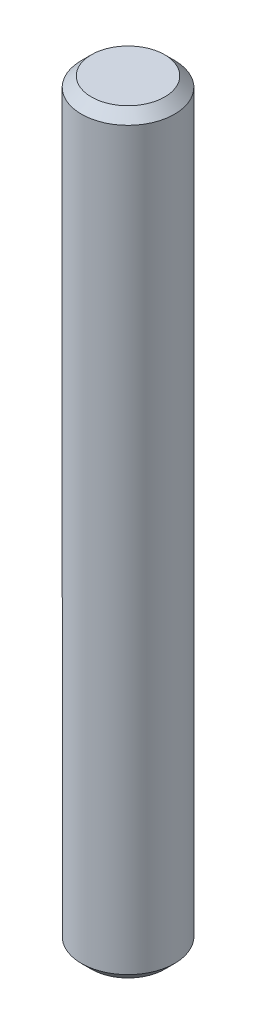
ISO-10303-21;
HEADER;
FILE_DESCRIPTION(('STEP AP214'),'2;1');
FILE_NAME('part.step','',(''),(''),'','','');
FILE_SCHEMA(('AUTOMOTIVE_DESIGN { 1 0 10303 214 1 1 1 1 }'));
ENDSEC;
DATA;
#1=APPLICATION_CONTEXT('core data for automotive mechanical design processes');
#2=APPLICATION_PROTOCOL_DEFINITION('international standard','automotive_design',2000,#1);
#3=PRODUCT_CONTEXT('',#1,'mechanical');
#4=PRODUCT('Part','Part','',(#3));
#5=PRODUCT_RELATED_PRODUCT_CATEGORY('part','',(#4));
#6=PRODUCT_DEFINITION_FORMATION('','',#4);
#7=PRODUCT_DEFINITION_CONTEXT('part definition',#1,'design');
#8=PRODUCT_DEFINITION('design','',#6,#7);
#9=PRODUCT_DEFINITION_SHAPE('','',#8);
#10=(LENGTH_UNIT() NAMED_UNIT(*) SI_UNIT(.MILLI.,.METRE.));
#11=(NAMED_UNIT(*) PLANE_ANGLE_UNIT() SI_UNIT($,.RADIAN.));
#12=(NAMED_UNIT(*) SI_UNIT($,.STERADIAN.) SOLID_ANGLE_UNIT());
#13=UNCERTAINTY_MEASURE_WITH_UNIT(LENGTH_MEASURE(1.E-05),#10,'distance_accuracy_value','');
#14=(GEOMETRIC_REPRESENTATION_CONTEXT(3) GLOBAL_UNCERTAINTY_ASSIGNED_CONTEXT((#13)) GLOBAL_UNIT_ASSIGNED_CONTEXT((#10,
#11,#12)) REPRESENTATION_CONTEXT('',''));
#15=CARTESIAN_POINT('',(0.,0.,0.));
#16=DIRECTION('',(0.,0.,1.));
#17=DIRECTION('',(1.,0.,0.));
#18=AXIS2_PLACEMENT_3D('',#15,#16,#17);
#19=CARTESIAN_POINT('',(0.,48.26,0.));
#20=DIRECTION('',(0.,-1.,0.));
#21=DIRECTION('',(0.,0.,-1.));
#22=AXIS2_PLACEMENT_3D('',#19,#20,#21);
#23=CYLINDRICAL_SURFACE('',#22,2.97500000000001);
#24=CARTESIAN_POINT('',(0.,0.635000000000018,0.));
#25=DIRECTION('',(0.,1.,0.));
#26=DIRECTION('',(0.,0.,1.));
#27=AXIS2_PLACEMENT_3D('',#24,#25,#26);
#28=CIRCLE('',#27,2.97500000000001);
#29=CARTESIAN_POINT('',(0.,0.635000000000018,-2.97500000000001));
#30=VERTEX_POINT('',#29);
#31=EDGE_CURVE('E59',#30,#30,#28,.T.);
#32=CARTESIAN_POINT('',(0.,47.625,0.));
#33=DIRECTION('',(0.,1.,0.));
#34=DIRECTION('',(0.,0.,1.));
#35=AXIS2_PLACEMENT_3D('',#32,#33,#34);
#36=CIRCLE('',#35,2.97500000000001);
#37=CARTESIAN_POINT('',(0.,47.625,-2.97500000000001));
#38=VERTEX_POINT('',#37);
#39=EDGE_CURVE('E64',#38,#38,#36,.F.);
#40=CARTESIAN_POINT('',(0.,0.635000000000018,-2.97500000000001));
#41=CARTESIAN_POINT('',(0.,1.12447916666668,-2.97500000000001));
#42=CARTESIAN_POINT('',(0.,1.61395833333335,-2.97500000000001));
#43=CARTESIAN_POINT('',(0.,2.59291666666669,-2.97500000000001));
#44=CARTESIAN_POINT('',(0.,3.08239583333335,-2.97500000000001));
#45=CARTESIAN_POINT('',(0.,4.06135416666668,-2.97500000000001));
#46=CARTESIAN_POINT('',(0.,4.55083333333335,-2.97500000000001));
#47=CARTESIAN_POINT('',(0.,5.52979166666668,-2.97500000000001));
#48=CARTESIAN_POINT('',(0.,6.01927083333335,-2.97500000000001));
#49=CARTESIAN_POINT('',(0.,6.99822916666668,-2.97500000000001));
#50=CARTESIAN_POINT('',(0.,7.48770833333335,-2.97500000000001));
#51=CARTESIAN_POINT('',(0.,8.46666666666668,-2.97500000000001));
#52=CARTESIAN_POINT('',(0.,8.95614583333335,-2.97500000000001));
#53=CARTESIAN_POINT('',(0.,9.93510416666669,-2.97500000000001));
#54=CARTESIAN_POINT('',(0.,10.4245833333334,-2.97500000000001));
#55=CARTESIAN_POINT('',(0.,11.4035416666667,-2.97500000000001));
#56=CARTESIAN_POINT('',(0.,11.8930208333334,-2.97500000000001));
#57=CARTESIAN_POINT('',(0.,12.8719791666667,-2.97500000000001));
#58=CARTESIAN_POINT('',(0.,13.3614583333333,-2.97500000000001));
#59=CARTESIAN_POINT('',(0.,14.3404166666667,-2.97500000000001));
#60=CARTESIAN_POINT('',(0.,14.8298958333333,-2.97500000000001));
#61=CARTESIAN_POINT('',(0.,15.8088541666667,-2.97500000000001));
#62=CARTESIAN_POINT('',(0.,16.2983333333334,-2.97500000000001));
#63=CARTESIAN_POINT('',(0.,17.2772916666667,-2.97500000000001));
#64=CARTESIAN_POINT('',(0.,17.7667708333334,-2.97500000000001));
#65=CARTESIAN_POINT('',(0.,18.7457291666667,-2.97500000000001));
#66=CARTESIAN_POINT('',(0.,19.2352083333333,-2.97500000000001));
#67=CARTESIAN_POINT('',(0.,20.2141666666667,-2.97500000000001));
#68=CARTESIAN_POINT('',(0.,20.7036458333334,-2.97500000000001));
#69=CARTESIAN_POINT('',(0.,21.6826041666667,-2.97500000000001));
#70=CARTESIAN_POINT('',(0.,22.1720833333334,-2.97500000000001));
#71=CARTESIAN_POINT('',(0.,23.1510416666667,-2.97500000000001));
#72=CARTESIAN_POINT('',(0.,23.6405208333333,-2.97500000000001));
#73=CARTESIAN_POINT('',(0.,24.6194791666667,-2.97500000000001));
#74=CARTESIAN_POINT('',(0.,25.1089583333333,-2.97500000000001));
#75=CARTESIAN_POINT('',(0.,26.0879166666667,-2.97500000000001));
#76=CARTESIAN_POINT('',(0.,26.5773958333333,-2.97500000000001));
#77=CARTESIAN_POINT('',(0.,27.5563541666667,-2.97500000000001));
#78=CARTESIAN_POINT('',(0.,28.0458333333333,-2.97500000000001));
#79=CARTESIAN_POINT('',(0.,29.0247916666667,-2.97500000000001));
#80=CARTESIAN_POINT('',(0.,29.5142708333333,-2.97500000000001));
#81=CARTESIAN_POINT('',(0.,30.4932291666667,-2.97500000000001));
#82=CARTESIAN_POINT('',(0.,30.9827083333333,-2.97500000000001));
#83=CARTESIAN_POINT('',(0.,31.9616666666667,-2.97500000000001));
#84=CARTESIAN_POINT('',(0.,32.4511458333333,-2.97500000000001));
#85=CARTESIAN_POINT('',(0.,33.4301041666667,-2.97500000000001));
#86=CARTESIAN_POINT('',(0.,33.9195833333333,-2.97500000000001));
#87=CARTESIAN_POINT('',(0.,34.8985416666667,-2.97500000000001));
#88=CARTESIAN_POINT('',(0.,35.3880208333333,-2.97500000000001));
#89=CARTESIAN_POINT('',(0.,36.3669791666667,-2.97500000000001));
#90=CARTESIAN_POINT('',(0.,36.8564583333334,-2.97500000000001));
#91=CARTESIAN_POINT('',(0.,37.8354166666667,-2.97500000000001));
#92=CARTESIAN_POINT('',(0.,38.3248958333333,-2.97500000000001));
#93=CARTESIAN_POINT('',(0.,39.3038541666667,-2.97500000000001));
#94=CARTESIAN_POINT('',(0.,39.7933333333334,-2.97500000000001));
#95=CARTESIAN_POINT('',(0.,40.7722916666667,-2.97500000000001));
#96=CARTESIAN_POINT('',(0.,41.2617708333334,-2.97500000000001));
#97=CARTESIAN_POINT('',(0.,42.2407291666667,-2.97500000000001));
#98=CARTESIAN_POINT('',(0.,42.7302083333333,-2.97500000000001));
#99=CARTESIAN_POINT('',(0.,43.7091666666667,-2.97500000000001));
#100=CARTESIAN_POINT('',(0.,44.1986458333334,-2.97500000000001));
#101=CARTESIAN_POINT('',(0.,45.1776041666667,-2.97500000000001));
#102=CARTESIAN_POINT('',(0.,45.6670833333333,-2.97500000000001));
#103=CARTESIAN_POINT('',(0.,46.6460416666667,-2.97500000000001));
#104=CARTESIAN_POINT('',(0.,47.1355208333333,-2.97500000000001));
#105=CARTESIAN_POINT('',(0.,47.625,-2.97500000000001));
#106=B_SPLINE_CURVE_WITH_KNOTS('',3,(#40,#41,#42,#43,#44,#45,#46,#47,#48,#49,#50,#51,#52,#53,
#54,#55,#56,#57,#58,#59,#60,#61,#62,#63,#64,#65,#66,#67,#68,#69,#70,#71,#72,#73,#74,#75,#76,#77,
#78,#79,#80,#81,#82,#83,#84,#85,#86,#87,#88,#89,#90,#91,#92,#93,#94,#95,#96,#97,#98,#99,#100,
#101,#102,#103,#104,#105),.UNSPECIFIED.,.F.,.F.,(4,2,2,2,2,2,2,2,2,2,2,2,2,2,2,2,2,2,2,2,2,2,2,
2,2,2,2,2,2,2,2,2,4),(0.,1.4684375,2.936875,4.4053125,5.87375,7.3421875,8.810625,10.2790625,
11.7475,13.2159375,14.684375,16.1528125,17.62125,19.0896875,20.558125,22.0265625,23.495,
24.9634375,26.431875,27.9003125,29.36875,30.8371875,32.305625,33.7740625,35.2425,36.7109375,
38.179375,39.6478125,41.11625,42.5846875,44.053125,45.5215625,46.99),.UNSPECIFIED.);
#107=EDGE_CURVE('BSEAM45',#30,#38,#106,.T.);
#108=ORIENTED_EDGE('',*,*,#31,.T.);
#109=ORIENTED_EDGE('',*,*,#39,.T.);
#110=ORIENTED_EDGE('',*,*,#107,.T.);
#111=ORIENTED_EDGE('',*,*,#107,.F.);
#112=EDGE_LOOP('',(#108,#110,#109,#111));
#113=FACE_BOUND('',#112,.T.);
#114=ADVANCED_FACE('F45',(#113),#23,.T.);
#115=CARTESIAN_POINT('',(0.,48.26,0.));
#116=DIRECTION('',(0.,1.,0.));
#117=DIRECTION('',(0.,0.,1.));
#118=AXIS2_PLACEMENT_3D('',#115,#116,#117);
#119=PLANE('',#118);
#120=CARTESIAN_POINT('',(0.,48.26,0.));
#121=DIRECTION('',(0.,1.,0.));
#122=DIRECTION('',(0.,0.,1.));
#123=AXIS2_PLACEMENT_3D('',#120,#121,#122);
#124=CIRCLE('',#123,2.34000000000004);
#125=CARTESIAN_POINT('',(0.,48.26,2.34000000000004));
#126=VERTEX_POINT('',#125);
#127=EDGE_CURVE('E10',#126,#126,#124,.T.);
#128=ORIENTED_EDGE('',*,*,#127,.T.);
#129=EDGE_LOOP('',(#128));
#130=FACE_BOUND('',#129,.T.);
#131=ADVANCED_FACE('F81',(#130),#119,.T.);
#132=CARTESIAN_POINT('',(0.,0.,0.));
#133=DIRECTION('',(0.,1.,0.));
#134=DIRECTION('',(0.,0.,1.));
#135=AXIS2_PLACEMENT_3D('',#132,#133,#134);
#136=PLANE('',#135);
#137=CARTESIAN_POINT('',(0.,0.,0.));
#138=DIRECTION('',(0.,1.,0.));
#139=DIRECTION('',(0.,0.,1.));
#140=AXIS2_PLACEMENT_3D('',#137,#138,#139);
#141=CIRCLE('',#140,2.33999999999998);
#142=CARTESIAN_POINT('',(0.,0.,2.33999999999998));
#143=VERTEX_POINT('',#142);
#144=EDGE_CURVE('E54',#143,#143,#141,.F.);
#145=ORIENTED_EDGE('',*,*,#144,.T.);
#146=EDGE_LOOP('',(#145));
#147=FACE_BOUND('',#146,.T.);
#148=ADVANCED_FACE('F78',(#147),#136,.F.);
#149=CARTESIAN_POINT('',(0.,0.635000000000018,0.));
#150=DIRECTION('',(0.,1.,0.));
#151=DIRECTION('',(0.,0.,1.));
#152=AXIS2_PLACEMENT_3D('',#149,#150,#151);
#153=CONICAL_SURFACE('',#152,2.97500000000001,0.785398163397454);
#154=ORIENTED_EDGE('',*,*,#144,.F.);
#155=EDGE_LOOP('',(#154));
#156=FACE_BOUND('',#155,.T.);
#157=ORIENTED_EDGE('',*,*,#31,.F.);
#158=EDGE_LOOP('',(#157));
#159=FACE_BOUND('',#158,.T.);
#160=ADVANCED_FACE('F74',(#156,#159),#153,.T.);
#161=CARTESIAN_POINT('',(0.,48.26,0.));
#162=DIRECTION('',(0.,-1.,0.));
#163=DIRECTION('',(0.,0.,-1.));
#164=AXIS2_PLACEMENT_3D('',#161,#162,#163);
#165=CONICAL_SURFACE('',#164,2.34000000000004,0.785398163397443);
#166=ORIENTED_EDGE('',*,*,#39,.F.);
#167=EDGE_LOOP('',(#166));
#168=FACE_BOUND('',#167,.T.);
#169=ORIENTED_EDGE('',*,*,#127,.F.);
#170=EDGE_LOOP('',(#169));
#171=FACE_BOUND('',#170,.T.);
#172=ADVANCED_FACE('F48',(#168,#171),#165,.T.);
#173=CLOSED_SHELL('',(#114,#131,#148,#160,#172));
#174=MANIFOLD_SOLID_BREP('B2',#173);
#175=ADVANCED_BREP_SHAPE_REPRESENTATION('',(#18,#174),#14);
#176=SHAPE_DEFINITION_REPRESENTATION(#9,#175);
ENDSEC;
END-ISO-10303-21;
